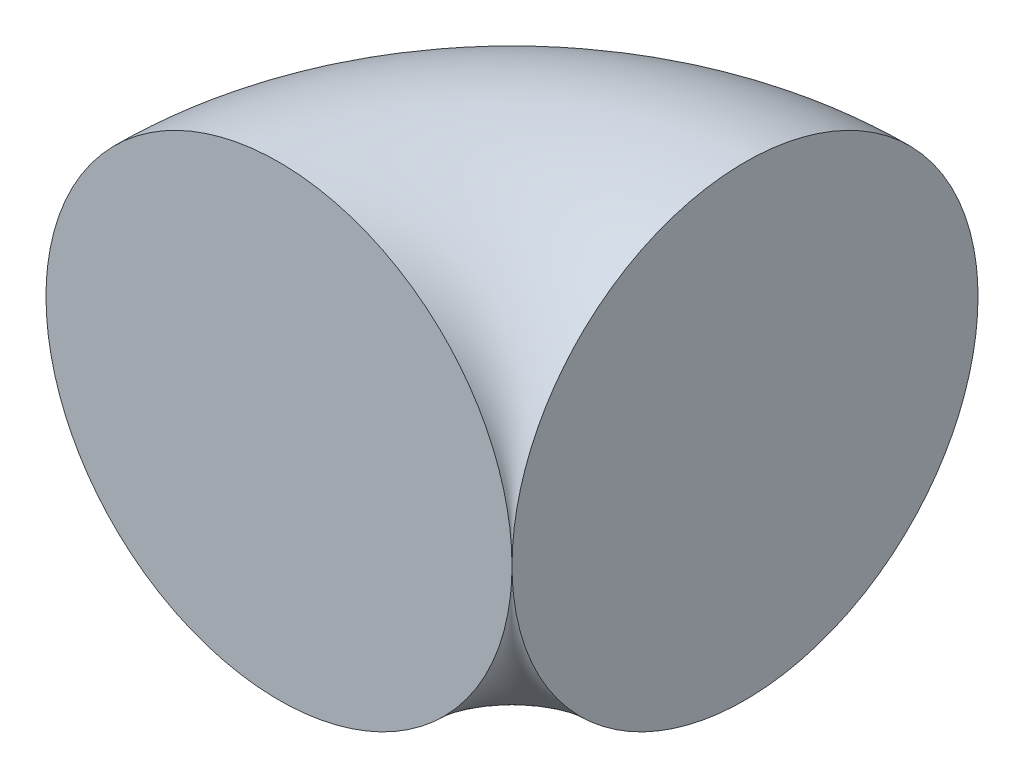
ISO-10303-21;
HEADER;
FILE_DESCRIPTION(('STEP AP214'),'2;1');
FILE_NAME('part.step','',(''),(''),'','','');
FILE_SCHEMA(('AUTOMOTIVE_DESIGN { 1 0 10303 214 1 1 1 1 }'));
ENDSEC;
DATA;
#1=APPLICATION_CONTEXT('core data for automotive mechanical design processes');
#2=APPLICATION_PROTOCOL_DEFINITION('international standard','automotive_design',2000,#1);
#3=PRODUCT_CONTEXT('',#1,'mechanical');
#4=PRODUCT('Part','Part','',(#3));
#5=PRODUCT_RELATED_PRODUCT_CATEGORY('part','',(#4));
#6=PRODUCT_DEFINITION_FORMATION('','',#4);
#7=PRODUCT_DEFINITION_CONTEXT('part definition',#1,'design');
#8=PRODUCT_DEFINITION('design','',#6,#7);
#9=PRODUCT_DEFINITION_SHAPE('','',#8);
#10=(LENGTH_UNIT() NAMED_UNIT(*) SI_UNIT(.MILLI.,.METRE.));
#11=(NAMED_UNIT(*) PLANE_ANGLE_UNIT() SI_UNIT($,.RADIAN.));
#12=(NAMED_UNIT(*) SI_UNIT($,.STERADIAN.) SOLID_ANGLE_UNIT());
#13=UNCERTAINTY_MEASURE_WITH_UNIT(LENGTH_MEASURE(1.E-05),#10,'distance_accuracy_value','');
#14=(GEOMETRIC_REPRESENTATION_CONTEXT(3) GLOBAL_UNCERTAINTY_ASSIGNED_CONTEXT((#13)) GLOBAL_UNIT_ASSIGNED_CONTEXT((#10,
#11,#12)) REPRESENTATION_CONTEXT('',''));
#15=CARTESIAN_POINT('',(0.,0.,0.));
#16=DIRECTION('',(0.,0.,1.));
#17=DIRECTION('',(1.,0.,0.));
#18=AXIS2_PLACEMENT_3D('',#15,#16,#17);
#19=CARTESIAN_POINT('',(1.725,0.125,0.25));
#20=CARTESIAN_POINT('',(1.725,-0.125,0.25));
#21=CARTESIAN_POINT('',(1.725,0.125,0.));
#22=CARTESIAN_POINT('',(1.725,-0.125,0.));
#23=(BOUNDED_SURFACE() B_SPLINE_SURFACE(1,1,((#19,#20),(#21,#22)),.UNSPECIFIED.,.F.,.F.,
.F.) B_SPLINE_SURFACE_WITH_KNOTS((2,2),(2,2),(-0.125,0.125),(-0.125,0.125),
.UNSPECIFIED.) GEOMETRIC_REPRESENTATION_ITEM() RATIONAL_B_SPLINE_SURFACE(((1.,1.),(1.,1.))) REPRESENTATION_ITEM('') SURFACE());
#24=CARTESIAN_POINT('',(1.725,0.,0.));
#25=CARTESIAN_POINT('',(1.725,-0.125,0.));
#26=CARTESIAN_POINT('',(1.725,-0.125,0.125));
#27=CARTESIAN_POINT('',(1.725,-0.125,0.25));
#28=CARTESIAN_POINT('',(1.725,0.,0.25));
#29=(BOUNDED_CURVE() B_SPLINE_CURVE(2,(#24,#25,#26,#27,#28),.UNSPECIFIED.,.F.,
.F.) B_SPLINE_CURVE_WITH_KNOTS((3,2,3),(0.,1.570796326795,3.14159265359),
.UNSPECIFIED.) CURVE() GEOMETRIC_REPRESENTATION_ITEM() RATIONAL_B_SPLINE_CURVE((1.,
0.707106781187,1.,0.707106781187,1.)) REPRESENTATION_ITEM(''));
#30=CARTESIAN_POINT('',(1.725,0.,0.));
#31=VERTEX_POINT('',#30);
#32=CARTESIAN_POINT('',(1.725,0.,0.25));
#33=VERTEX_POINT('',#32);
#34=EDGE_CURVE('E32',#31,#33,#29,.T.);
#35=CARTESIAN_POINT('',(1.725,0.,0.25));
#36=CARTESIAN_POINT('',(1.725,0.125,0.25));
#37=CARTESIAN_POINT('',(1.725,0.125,0.125));
#38=CARTESIAN_POINT('',(1.725,0.125,0.));
#39=CARTESIAN_POINT('',(1.725,0.,0.));
#40=(BOUNDED_CURVE() B_SPLINE_CURVE(2,(#35,#36,#37,#38,#39),.UNSPECIFIED.,.F.,
.F.) B_SPLINE_CURVE_WITH_KNOTS((3,2,3),(3.14159265359,4.712388980385,6.28318530718),
.UNSPECIFIED.) CURVE() GEOMETRIC_REPRESENTATION_ITEM() RATIONAL_B_SPLINE_CURVE((1.,
0.707106781187,1.,0.707106781187,1.)) REPRESENTATION_ITEM(''));
#41=EDGE_CURVE('E61',#33,#31,#40,.T.);
#42=ORIENTED_EDGE('',*,*,#34,.F.);
#43=ORIENTED_EDGE('',*,*,#41,.F.);
#44=EDGE_LOOP('',(#42,#43));
#45=FACE_BOUND('',#44,.T.);
#46=ADVANCED_FACE('F17',(#45),#23,.F.);
#47=CARTESIAN_POINT('',(1.725,-0.125,0.25));
#48=CARTESIAN_POINT('',(1.475,-0.125,0.25));
#49=CARTESIAN_POINT('',(1.725,0.125,0.25));
#50=CARTESIAN_POINT('',(1.475,0.125,0.25));
#51=(BOUNDED_SURFACE() B_SPLINE_SURFACE(1,1,((#47,#48),(#49,#50)),.UNSPECIFIED.,.F.,.F.,
.F.) B_SPLINE_SURFACE_WITH_KNOTS((2,2),(2,2),(-0.125,0.125),(-0.125,0.125),
.UNSPECIFIED.) GEOMETRIC_REPRESENTATION_ITEM() RATIONAL_B_SPLINE_SURFACE(((1.,1.),(1.,1.))) REPRESENTATION_ITEM('') SURFACE());
#52=CARTESIAN_POINT('',(1.725,0.,0.25));
#53=CARTESIAN_POINT('',(1.725,0.125,0.25));
#54=CARTESIAN_POINT('',(1.6,0.125,0.25));
#55=CARTESIAN_POINT('',(1.475,0.125,0.25));
#56=CARTESIAN_POINT('',(1.475,0.,0.25));
#57=(BOUNDED_CURVE() B_SPLINE_CURVE(2,(#52,#53,#54,#55,#56),.UNSPECIFIED.,.F.,
.F.) B_SPLINE_CURVE_WITH_KNOTS((3,2,3),(3.14159265359,4.712388980385,6.28318530718),
.UNSPECIFIED.) CURVE() GEOMETRIC_REPRESENTATION_ITEM() RATIONAL_B_SPLINE_CURVE((1.,
0.707106781187,1.,0.707106781187,1.)) REPRESENTATION_ITEM(''));
#58=CARTESIAN_POINT('',(1.475,0.,0.25));
#59=VERTEX_POINT('',#58);
#60=EDGE_CURVE('E52',#33,#59,#57,.T.);
#61=CARTESIAN_POINT('',(1.475,0.,0.25));
#62=CARTESIAN_POINT('',(1.475,-0.125,0.25));
#63=CARTESIAN_POINT('',(1.6,-0.125,0.25));
#64=CARTESIAN_POINT('',(1.725,-0.125,0.25));
#65=CARTESIAN_POINT('',(1.725,0.,0.25));
#66=(BOUNDED_CURVE() B_SPLINE_CURVE(2,(#61,#62,#63,#64,#65),.UNSPECIFIED.,.F.,
.F.) B_SPLINE_CURVE_WITH_KNOTS((3,2,3),(0.,1.570796326795,3.14159265359),
.UNSPECIFIED.) CURVE() GEOMETRIC_REPRESENTATION_ITEM() RATIONAL_B_SPLINE_CURVE((1.,
0.707106781187,1.,0.707106781187,1.)) REPRESENTATION_ITEM(''));
#67=EDGE_CURVE('E11',#59,#33,#66,.T.);
#68=ORIENTED_EDGE('',*,*,#60,.T.);
#69=ORIENTED_EDGE('',*,*,#67,.T.);
#70=EDGE_LOOP('',(#68,#69));
#71=FACE_BOUND('',#70,.T.);
#72=ADVANCED_FACE('F50',(#71),#51,.T.);
#73=CARTESIAN_POINT('',(1.475,0.,0.25));
#74=CARTESIAN_POINT('',(1.475,-0.125,0.25));
#75=CARTESIAN_POINT('',(1.6,-0.125,0.25));
#76=CARTESIAN_POINT('',(1.725,-0.125,0.25));
#77=CARTESIAN_POINT('',(1.725,0.,0.25));
#78=CARTESIAN_POINT('',(1.475,0.,0.));
#79=CARTESIAN_POINT('',(1.475,-0.125,0.));
#80=CARTESIAN_POINT('',(1.6,-0.125,0.125));
#81=CARTESIAN_POINT('',(1.725,-0.125,0.25));
#82=CARTESIAN_POINT('',(1.725,0.,0.25));
#83=CARTESIAN_POINT('',(1.725,0.,0.));
#84=CARTESIAN_POINT('',(1.725,-0.125,0.));
#85=CARTESIAN_POINT('',(1.725,-0.125,0.125));
#86=CARTESIAN_POINT('',(1.725,-0.125,0.25));
#87=CARTESIAN_POINT('',(1.725,0.,0.25));
#88=(BOUNDED_SURFACE() B_SPLINE_SURFACE(2,2,((#73,#74,#75,#76,#77),(#78,#79,#80,#81,#82),(#83,
#84,#85,#86,#87)),.UNSPECIFIED.,.F.,.F.,.F.) B_SPLINE_SURFACE_WITH_KNOTS((3,3),(3,2,3),
(3.14159265359,4.712388980385),(0.,1.570796326795,3.14159265359),
.UNSPECIFIED.) GEOMETRIC_REPRESENTATION_ITEM() RATIONAL_B_SPLINE_SURFACE(((1.,0.707106781187,1.,
0.707106781187,1.),(0.707106781187,0.5,0.707106781187,0.5,0.707106781187),(1.,0.707106781187,1.,
0.707106781187,1.))) REPRESENTATION_ITEM('') SURFACE());
#89=CARTESIAN_POINT('',(1.475,0.,0.25));
#90=CARTESIAN_POINT('',(1.475,0.,0.));
#91=CARTESIAN_POINT('',(1.725,0.,0.));
#92=(BOUNDED_CURVE() B_SPLINE_CURVE(2,(#89,#90,#91),.UNSPECIFIED.,.F.,
.F.) B_SPLINE_CURVE_WITH_KNOTS((3,3),(3.14159265359,4.712388980385),
.UNSPECIFIED.) CURVE() GEOMETRIC_REPRESENTATION_ITEM() RATIONAL_B_SPLINE_CURVE((1.,
0.707106781187,1.)) REPRESENTATION_ITEM(''));
#93=EDGE_CURVE('E23',#59,#31,#92,.T.);
#94=ORIENTED_EDGE('',*,*,#93,.T.);
#95=ORIENTED_EDGE('',*,*,#34,.T.);
#96=ORIENTED_EDGE('',*,*,#67,.F.);
#97=EDGE_LOOP('',(#94,#95,#96));
#98=FACE_BOUND('',#97,.T.);
#99=ADVANCED_FACE('F19',(#98),#88,.T.);
#100=CARTESIAN_POINT('',(1.725,0.,0.25));
#101=CARTESIAN_POINT('',(1.725,0.125,0.25));
#102=CARTESIAN_POINT('',(1.6,0.125,0.25));
#103=CARTESIAN_POINT('',(1.475,0.125,0.25));
#104=CARTESIAN_POINT('',(1.475,0.,0.25));
#105=CARTESIAN_POINT('',(1.725,0.,0.25));
#106=CARTESIAN_POINT('',(1.725,0.125,0.25));
#107=CARTESIAN_POINT('',(1.6,0.125,0.125));
#108=CARTESIAN_POINT('',(1.475,0.125,0.));
#109=CARTESIAN_POINT('',(1.475,0.,0.));
#110=CARTESIAN_POINT('',(1.725,0.,0.25));
#111=CARTESIAN_POINT('',(1.725,0.125,0.25));
#112=CARTESIAN_POINT('',(1.725,0.125,0.125));
#113=CARTESIAN_POINT('',(1.725,0.125,0.));
#114=CARTESIAN_POINT('',(1.725,0.,0.));
#115=(BOUNDED_SURFACE() B_SPLINE_SURFACE(2,2,((#100,#101,#102,#103,#104),(#105,#106,#107,#108,
#109),(#110,#111,#112,#113,#114)),.UNSPECIFIED.,.F.,.F.,.F.) B_SPLINE_SURFACE_WITH_KNOTS((3,3),
(3,2,3),(3.14159265359,4.712388980385),(3.14159265359,4.712388980385,6.28318530718),
.UNSPECIFIED.) GEOMETRIC_REPRESENTATION_ITEM() RATIONAL_B_SPLINE_SURFACE(((1.,0.707106781187,1.,
0.707106781187,1.),(0.707106781186,0.5,0.707106781186,0.5,0.707106781186),(1.,0.707106781187,1.,
0.707106781187,1.))) REPRESENTATION_ITEM('') SURFACE());
#116=ORIENTED_EDGE('',*,*,#41,.T.);
#117=ORIENTED_EDGE('',*,*,#93,.F.);
#118=ORIENTED_EDGE('',*,*,#60,.F.);
#119=EDGE_LOOP('',(#116,#117,#118));
#120=FACE_BOUND('',#119,.T.);
#121=ADVANCED_FACE('F60',(#120),#115,.T.);
#122=CLOSED_SHELL('',(#46,#72,#99,#121));
#123=MANIFOLD_SOLID_BREP('B1',#122);
#124=ADVANCED_BREP_SHAPE_REPRESENTATION('',(#18,#123),#14);
#125=SHAPE_DEFINITION_REPRESENTATION(#9,#124);
ENDSEC;
END-ISO-10303-21;
